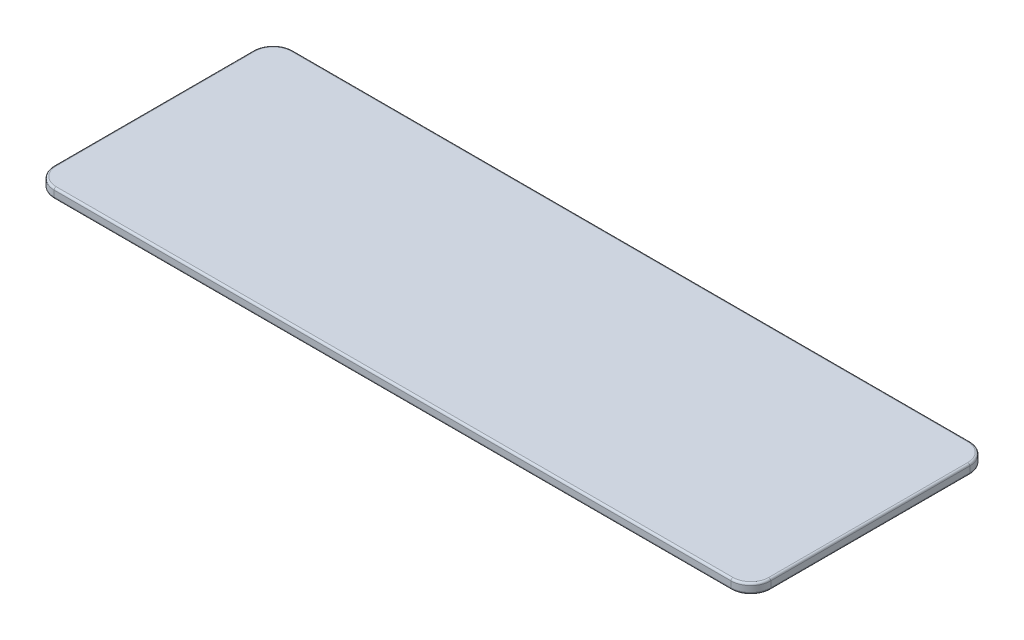
ISO-10303-21;
HEADER;
FILE_DESCRIPTION(('STEP AP214'),'2;1');
FILE_NAME('part.step','',(''),(''),'','','');
FILE_SCHEMA(('AUTOMOTIVE_DESIGN { 1 0 10303 214 1 1 1 1 }'));
ENDSEC;
DATA;
#1=APPLICATION_CONTEXT('core data for automotive mechanical design processes');
#2=APPLICATION_PROTOCOL_DEFINITION('international standard','automotive_design',2000,#1);
#3=PRODUCT_CONTEXT('',#1,'mechanical');
#4=PRODUCT('Part','Part','',(#3));
#5=PRODUCT_RELATED_PRODUCT_CATEGORY('part','',(#4));
#6=PRODUCT_DEFINITION_FORMATION('','',#4);
#7=PRODUCT_DEFINITION_CONTEXT('part definition',#1,'design');
#8=PRODUCT_DEFINITION('design','',#6,#7);
#9=PRODUCT_DEFINITION_SHAPE('','',#8);
#10=(LENGTH_UNIT() NAMED_UNIT(*) SI_UNIT(.MILLI.,.METRE.));
#11=(NAMED_UNIT(*) PLANE_ANGLE_UNIT() SI_UNIT($,.RADIAN.));
#12=(NAMED_UNIT(*) SI_UNIT($,.STERADIAN.) SOLID_ANGLE_UNIT());
#13=UNCERTAINTY_MEASURE_WITH_UNIT(LENGTH_MEASURE(1.E-05),#10,'distance_accuracy_value','');
#14=(GEOMETRIC_REPRESENTATION_CONTEXT(3) GLOBAL_UNCERTAINTY_ASSIGNED_CONTEXT((#13)) GLOBAL_UNIT_ASSIGNED_CONTEXT((#10,
#11,#12)) REPRESENTATION_CONTEXT('',''));
#15=CARTESIAN_POINT('',(0.,0.,0.));
#16=DIRECTION('',(0.,0.,1.));
#17=DIRECTION('',(1.,0.,0.));
#18=AXIS2_PLACEMENT_3D('',#15,#16,#17);
#19=CARTESIAN_POINT('',(-228.6,6.35,-76.2));
#20=DIRECTION('',(1.,0.,0.));
#21=DIRECTION('',(0.,0.,-1.));
#22=AXIS2_PLACEMENT_3D('',#19,#20,#21);
#23=PLANE('',#22);
#24=DIRECTION('',(0.,-1.,0.));
#25=VECTOR('',#24,1.);
#26=CARTESIAN_POINT('',(-228.6,6.35,63.5));
#27=LINE('',#26,#25);
#28=CARTESIAN_POINT('',(-228.6,1.27,63.5));
#29=VERTEX_POINT('',#28);
#30=CARTESIAN_POINT('',(-228.6,5.08,63.5));
#31=VERTEX_POINT('',#30);
#32=EDGE_CURVE('E277',#29,#31,#27,.F.);
#33=ORIENTED_EDGE('',*,*,#32,.T.);
#34=DIRECTION('',(0.,0.,1.));
#35=VECTOR('',#34,1.);
#36=CARTESIAN_POINT('',(-228.6,5.08,-63.5));
#37=LINE('',#36,#35);
#38=CARTESIAN_POINT('',(-228.6,5.08,-63.5));
#39=VERTEX_POINT('',#38);
#40=EDGE_CURVE('E182',#31,#39,#37,.F.);
#41=ORIENTED_EDGE('',*,*,#40,.T.);
#42=DIRECTION('',(0.,-1.,0.));
#43=VECTOR('',#42,1.);
#44=CARTESIAN_POINT('',(-228.6,6.35,-63.5));
#45=LINE('',#44,#43);
#46=CARTESIAN_POINT('',(-228.6,1.27,-63.5));
#47=VERTEX_POINT('',#46);
#48=EDGE_CURVE('E166',#39,#47,#45,.T.);
#49=ORIENTED_EDGE('',*,*,#48,.T.);
#50=DIRECTION('',(0.,0.,1.));
#51=VECTOR('',#50,1.);
#52=CARTESIAN_POINT('',(-228.6,1.27,-76.2));
#53=LINE('',#52,#51);
#54=EDGE_CURVE('E180',#47,#29,#53,.T.);
#55=ORIENTED_EDGE('',*,*,#54,.T.);
#56=EDGE_LOOP('',(#33,#41,#49,#55));
#57=FACE_BOUND('',#56,.T.);
#58=ADVANCED_FACE('F33',(#57),#23,.F.);
#59=CARTESIAN_POINT('',(-228.6,6.35,76.2));
#60=DIRECTION('',(0.,0.,-1.));
#61=DIRECTION('',(-1.,0.,0.));
#62=AXIS2_PLACEMENT_3D('',#59,#60,#61);
#63=PLANE('',#62);
#64=DIRECTION('',(0.,-1.,0.));
#65=VECTOR('',#64,1.);
#66=CARTESIAN_POINT('',(215.9,6.35,76.2));
#67=LINE('',#66,#65);
#68=CARTESIAN_POINT('',(215.9,1.27,76.2));
#69=VERTEX_POINT('',#68);
#70=CARTESIAN_POINT('',(215.9,5.08,76.2));
#71=VERTEX_POINT('',#70);
#72=EDGE_CURVE('E282',#69,#71,#67,.F.);
#73=ORIENTED_EDGE('',*,*,#72,.T.);
#74=DIRECTION('',(1.,0.,0.));
#75=VECTOR('',#74,1.);
#76=CARTESIAN_POINT('',(-215.9,5.08,76.2));
#77=LINE('',#76,#75);
#78=CARTESIAN_POINT('',(-215.9,5.08,76.2));
#79=VERTEX_POINT('',#78);
#80=EDGE_CURVE('E207',#71,#79,#77,.F.);
#81=ORIENTED_EDGE('',*,*,#80,.T.);
#82=DIRECTION('',(0.,-1.,0.));
#83=VECTOR('',#82,1.);
#84=CARTESIAN_POINT('',(-215.9,6.35,76.2));
#85=LINE('',#84,#83);
#86=CARTESIAN_POINT('',(-215.9,1.27,76.2));
#87=VERTEX_POINT('',#86);
#88=EDGE_CURVE('E275',#79,#87,#85,.T.);
#89=ORIENTED_EDGE('',*,*,#88,.T.);
#90=DIRECTION('',(1.,0.,0.));
#91=VECTOR('',#90,1.);
#92=CARTESIAN_POINT('',(-228.6,1.27,76.2));
#93=LINE('',#92,#91);
#94=EDGE_CURVE('E205',#87,#69,#93,.T.);
#95=ORIENTED_EDGE('',*,*,#94,.T.);
#96=EDGE_LOOP('',(#73,#81,#89,#95));
#97=FACE_BOUND('',#96,.T.);
#98=ADVANCED_FACE('F280',(#97),#63,.F.);
#99=CARTESIAN_POINT('',(228.6,6.35,-76.2));
#100=DIRECTION('',(-1.,0.,0.));
#101=DIRECTION('',(0.,0.,1.));
#102=AXIS2_PLACEMENT_3D('',#99,#100,#101);
#103=PLANE('',#102);
#104=DIRECTION('',(0.,-1.,0.));
#105=VECTOR('',#104,1.);
#106=CARTESIAN_POINT('',(228.6,6.35,-63.5));
#107=LINE('',#106,#105);
#108=CARTESIAN_POINT('',(228.6,1.27,-63.5));
#109=VERTEX_POINT('',#108);
#110=CARTESIAN_POINT('',(228.6,5.08,-63.5));
#111=VERTEX_POINT('',#110);
#112=EDGE_CURVE('E238',#109,#111,#107,.F.);
#113=ORIENTED_EDGE('',*,*,#112,.T.);
#114=DIRECTION('',(0.,0.,-1.));
#115=VECTOR('',#114,1.);
#116=CARTESIAN_POINT('',(228.6,5.08,63.5));
#117=LINE('',#116,#115);
#118=CARTESIAN_POINT('',(228.6,5.08,63.5));
#119=VERTEX_POINT('',#118);
#120=EDGE_CURVE('E199',#111,#119,#117,.F.);
#121=ORIENTED_EDGE('',*,*,#120,.T.);
#122=DIRECTION('',(0.,-1.,0.));
#123=VECTOR('',#122,1.);
#124=CARTESIAN_POINT('',(228.6,6.35,63.5));
#125=LINE('',#124,#123);
#126=CARTESIAN_POINT('',(228.6,1.27,63.5));
#127=VERTEX_POINT('',#126);
#128=EDGE_CURVE('E283',#119,#127,#125,.T.);
#129=ORIENTED_EDGE('',*,*,#128,.T.);
#130=DIRECTION('',(0.,0.,-1.));
#131=VECTOR('',#130,1.);
#132=CARTESIAN_POINT('',(228.6,1.27,-76.2));
#133=LINE('',#132,#131);
#134=EDGE_CURVE('E197',#127,#109,#133,.T.);
#135=ORIENTED_EDGE('',*,*,#134,.T.);
#136=EDGE_LOOP('',(#113,#121,#129,#135));
#137=FACE_BOUND('',#136,.T.);
#138=ADVANCED_FACE('F345',(#137),#103,.F.);
#139=CARTESIAN_POINT('',(-228.6,6.35,-76.2));
#140=DIRECTION('',(0.,0.,1.));
#141=DIRECTION('',(1.,0.,0.));
#142=AXIS2_PLACEMENT_3D('',#139,#140,#141);
#143=PLANE('',#142);
#144=DIRECTION('',(0.,-1.,0.));
#145=VECTOR('',#144,1.);
#146=CARTESIAN_POINT('',(-215.9,6.35,-76.2));
#147=LINE('',#146,#145);
#148=CARTESIAN_POINT('',(-215.9,1.27,-76.2));
#149=VERTEX_POINT('',#148);
#150=CARTESIAN_POINT('',(-215.9,5.08,-76.2));
#151=VERTEX_POINT('',#150);
#152=EDGE_CURVE('E285',#149,#151,#147,.F.);
#153=ORIENTED_EDGE('',*,*,#152,.T.);
#154=DIRECTION('',(-1.,0.,0.));
#155=VECTOR('',#154,1.);
#156=CARTESIAN_POINT('',(215.9,5.08,-76.2));
#157=LINE('',#156,#155);
#158=CARTESIAN_POINT('',(215.9,5.08,-76.2));
#159=VERTEX_POINT('',#158);
#160=EDGE_CURVE('E190',#151,#159,#157,.F.);
#161=ORIENTED_EDGE('',*,*,#160,.T.);
#162=DIRECTION('',(0.,-1.,0.));
#163=VECTOR('',#162,1.);
#164=CARTESIAN_POINT('',(215.9,6.35,-76.2));
#165=LINE('',#164,#163);
#166=CARTESIAN_POINT('',(215.9,1.27,-76.2));
#167=VERTEX_POINT('',#166);
#168=EDGE_CURVE('E293',#159,#167,#165,.T.);
#169=ORIENTED_EDGE('',*,*,#168,.T.);
#170=DIRECTION('',(-1.,0.,0.));
#171=VECTOR('',#170,1.);
#172=CARTESIAN_POINT('',(-228.6,1.27,-76.2));
#173=LINE('',#172,#171);
#174=EDGE_CURVE('E188',#167,#149,#173,.T.);
#175=ORIENTED_EDGE('',*,*,#174,.T.);
#176=EDGE_LOOP('',(#153,#161,#169,#175));
#177=FACE_BOUND('',#176,.T.);
#178=ADVANCED_FACE('F361',(#177),#143,.F.);
#179=CARTESIAN_POINT('',(-228.6,6.35,76.2));
#180=DIRECTION('',(0.,1.,0.));
#181=DIRECTION('',(0.,0.,1.));
#182=AXIS2_PLACEMENT_3D('',#179,#180,#181);
#183=PLANE('',#182);
#184=DIRECTION('',(0.,0.,1.));
#185=VECTOR('',#184,1.);
#186=CARTESIAN_POINT('',(-227.33,6.35,63.4999999999999));
#187=LINE('',#186,#185);
#188=CARTESIAN_POINT('',(-227.33,6.35,-63.5));
#189=VERTEX_POINT('',#188);
#190=CARTESIAN_POINT('',(-227.33,6.35,63.5));
#191=VERTEX_POINT('',#190);
#192=EDGE_CURVE('E170',#189,#191,#187,.T.);
#193=ORIENTED_EDGE('',*,*,#192,.T.);
#194=CARTESIAN_POINT('',(-215.9,6.35,63.5));
#195=DIRECTION('',(0.,1.,0.));
#196=DIRECTION('',(0.,0.,1.));
#197=AXIS2_PLACEMENT_3D('',#194,#195,#196);
#198=CIRCLE('',#197,11.43);
#199=CARTESIAN_POINT('',(-215.9,6.35,74.93));
#200=VERTEX_POINT('',#199);
#201=EDGE_CURVE('E151',#191,#200,#198,.T.);
#202=ORIENTED_EDGE('',*,*,#201,.T.);
#203=DIRECTION('',(1.,0.,0.));
#204=VECTOR('',#203,1.);
#205=CARTESIAN_POINT('',(215.9,6.35,74.93));
#206=LINE('',#205,#204);
#207=CARTESIAN_POINT('',(215.9,6.35,74.93));
#208=VERTEX_POINT('',#207);
#209=EDGE_CURVE('E159',#200,#208,#206,.T.);
#210=ORIENTED_EDGE('',*,*,#209,.T.);
#211=CARTESIAN_POINT('',(215.9,6.35,63.5));
#212=DIRECTION('',(0.,1.,0.));
#213=DIRECTION('',(0.,0.,1.));
#214=AXIS2_PLACEMENT_3D('',#211,#212,#213);
#215=CIRCLE('',#214,11.43);
#216=CARTESIAN_POINT('',(227.33,6.35,63.5));
#217=VERTEX_POINT('',#216);
#218=EDGE_CURVE('E165',#208,#217,#215,.T.);
#219=ORIENTED_EDGE('',*,*,#218,.T.);
#220=DIRECTION('',(0.,0.,-1.));
#221=VECTOR('',#220,1.);
#222=CARTESIAN_POINT('',(227.33,6.35,-63.5));
#223=LINE('',#222,#221);
#224=CARTESIAN_POINT('',(227.33,6.35,-63.5));
#225=VERTEX_POINT('',#224);
#226=EDGE_CURVE('E300',#217,#225,#223,.T.);
#227=ORIENTED_EDGE('',*,*,#226,.T.);
#228=CARTESIAN_POINT('',(215.9,6.35,-63.5));
#229=DIRECTION('',(0.,1.,0.));
#230=DIRECTION('',(0.,0.,1.));
#231=AXIS2_PLACEMENT_3D('',#228,#229,#230);
#232=CIRCLE('',#231,11.43);
#233=CARTESIAN_POINT('',(215.9,6.35,-74.93));
#234=VERTEX_POINT('',#233);
#235=EDGE_CURVE('E302',#225,#234,#232,.T.);
#236=ORIENTED_EDGE('',*,*,#235,.T.);
#237=DIRECTION('',(-1.,0.,0.));
#238=VECTOR('',#237,1.);
#239=CARTESIAN_POINT('',(-215.9,6.35,-74.93));
#240=LINE('',#239,#238);
#241=CARTESIAN_POINT('',(-215.9,6.35,-74.93));
#242=VERTEX_POINT('',#241);
#243=EDGE_CURVE('E304',#234,#242,#240,.T.);
#244=ORIENTED_EDGE('',*,*,#243,.T.);
#245=CARTESIAN_POINT('',(-215.9,6.35,-63.5));
#246=DIRECTION('',(0.,1.,0.));
#247=DIRECTION('',(0.,0.,1.));
#248=AXIS2_PLACEMENT_3D('',#245,#246,#247);
#249=CIRCLE('',#248,11.43);
#250=EDGE_CURVE('E175',#242,#189,#249,.T.);
#251=ORIENTED_EDGE('',*,*,#250,.T.);
#252=EDGE_LOOP('',(#193,#202,#210,#219,#227,#236,#244,#251));
#253=FACE_BOUND('',#252,.T.);
#254=ADVANCED_FACE('F168',(#253),#183,.T.);
#255=CARTESIAN_POINT('',(-228.6,0.,76.2));
#256=DIRECTION('',(0.,1.,0.));
#257=DIRECTION('',(0.,0.,1.));
#258=AXIS2_PLACEMENT_3D('',#255,#256,#257);
#259=PLANE('',#258);
#260=DIRECTION('',(-1.,0.,0.));
#261=VECTOR('',#260,1.);
#262=CARTESIAN_POINT('',(-228.6,0.,-74.93));
#263=LINE('',#262,#261);
#264=CARTESIAN_POINT('',(-215.9,0.,-74.93));
#265=VERTEX_POINT('',#264);
#266=CARTESIAN_POINT('',(215.9,0.,-74.93));
#267=VERTEX_POINT('',#266);
#268=EDGE_CURVE('E42',#265,#267,#263,.F.);
#269=ORIENTED_EDGE('',*,*,#268,.T.);
#270=CARTESIAN_POINT('',(215.9,0.,-63.5));
#271=DIRECTION('',(0.,1.,0.));
#272=DIRECTION('',(0.,0.,1.));
#273=AXIS2_PLACEMENT_3D('',#270,#271,#272);
#274=CIRCLE('',#273,11.43);
#275=CARTESIAN_POINT('',(227.33,0.,-63.5));
#276=VERTEX_POINT('',#275);
#277=EDGE_CURVE('E11',#267,#276,#274,.F.);
#278=ORIENTED_EDGE('',*,*,#277,.T.);
#279=DIRECTION('',(0.,0.,-1.));
#280=VECTOR('',#279,1.);
#281=CARTESIAN_POINT('',(227.33,0.,76.2));
#282=LINE('',#281,#280);
#283=CARTESIAN_POINT('',(227.33,0.,63.5));
#284=VERTEX_POINT('',#283);
#285=EDGE_CURVE('E209',#276,#284,#282,.F.);
#286=ORIENTED_EDGE('',*,*,#285,.T.);
#287=CARTESIAN_POINT('',(215.9,0.,63.5));
#288=DIRECTION('',(0.,1.,0.));
#289=DIRECTION('',(0.,0.,1.));
#290=AXIS2_PLACEMENT_3D('',#287,#288,#289);
#291=CIRCLE('',#290,11.43);
#292=CARTESIAN_POINT('',(215.9,0.,74.93));
#293=VERTEX_POINT('',#292);
#294=EDGE_CURVE('E211',#284,#293,#291,.F.);
#295=ORIENTED_EDGE('',*,*,#294,.T.);
#296=DIRECTION('',(1.,0.,0.));
#297=VECTOR('',#296,1.);
#298=CARTESIAN_POINT('',(-228.6,0.,74.93));
#299=LINE('',#298,#297);
#300=CARTESIAN_POINT('',(-215.9,0.,74.93));
#301=VERTEX_POINT('',#300);
#302=EDGE_CURVE('E213',#293,#301,#299,.F.);
#303=ORIENTED_EDGE('',*,*,#302,.T.);
#304=CARTESIAN_POINT('',(-215.9,0.,63.5));
#305=DIRECTION('',(0.,1.,0.));
#306=DIRECTION('',(0.,0.,1.));
#307=AXIS2_PLACEMENT_3D('',#304,#305,#306);
#308=CIRCLE('',#307,11.43);
#309=CARTESIAN_POINT('',(-227.33,0.,63.5));
#310=VERTEX_POINT('',#309);
#311=EDGE_CURVE('E215',#301,#310,#308,.F.);
#312=ORIENTED_EDGE('',*,*,#311,.T.);
#313=DIRECTION('',(0.,0.,1.));
#314=VECTOR('',#313,1.);
#315=CARTESIAN_POINT('',(-227.33,0.,76.2));
#316=LINE('',#315,#314);
#317=CARTESIAN_POINT('',(-227.33,0.,-63.5));
#318=VERTEX_POINT('',#317);
#319=EDGE_CURVE('E217',#310,#318,#316,.F.);
#320=ORIENTED_EDGE('',*,*,#319,.T.);
#321=CARTESIAN_POINT('',(-215.9,0.,-63.5));
#322=DIRECTION('',(0.,1.,0.));
#323=DIRECTION('',(0.,0.,1.));
#324=AXIS2_PLACEMENT_3D('',#321,#322,#323);
#325=CIRCLE('',#324,11.43);
#326=EDGE_CURVE('E53',#318,#265,#325,.F.);
#327=ORIENTED_EDGE('',*,*,#326,.T.);
#328=EDGE_LOOP('',(#269,#278,#286,#295,#303,#312,#320,#327));
#329=FACE_BOUND('',#328,.T.);
#330=ADVANCED_FACE('F332',(#329),#259,.F.);
#331=CARTESIAN_POINT('',(215.9,6.35,63.5));
#332=DIRECTION('',(0.,-1.,0.));
#333=DIRECTION('',(0.,0.,-1.));
#334=AXIS2_PLACEMENT_3D('',#331,#332,#333);
#335=CYLINDRICAL_SURFACE('',#334,12.7);
#336=ORIENTED_EDGE('',*,*,#128,.F.);
#337=CARTESIAN_POINT('',(215.9,5.08,63.5));
#338=DIRECTION('',(0.,1.,0.));
#339=DIRECTION('',(0.,0.,1.));
#340=AXIS2_PLACEMENT_3D('',#337,#338,#339);
#341=CIRCLE('',#340,12.7);
#342=EDGE_CURVE('E203',#119,#71,#341,.F.);
#343=ORIENTED_EDGE('',*,*,#342,.T.);
#344=ORIENTED_EDGE('',*,*,#72,.F.);
#345=CARTESIAN_POINT('',(215.9,1.27,63.5));
#346=DIRECTION('',(0.,1.,0.));
#347=DIRECTION('',(0.,0.,1.));
#348=AXIS2_PLACEMENT_3D('',#345,#346,#347);
#349=CIRCLE('',#348,12.7);
#350=EDGE_CURVE('E201',#69,#127,#349,.T.);
#351=ORIENTED_EDGE('',*,*,#350,.T.);
#352=EDGE_LOOP('',(#336,#343,#344,#351));
#353=FACE_BOUND('',#352,.T.);
#354=ADVANCED_FACE('F378',(#353),#335,.T.);
#355=CARTESIAN_POINT('',(215.9,6.35,-63.5));
#356=DIRECTION('',(0.,-1.,0.));
#357=DIRECTION('',(0.,0.,-1.));
#358=AXIS2_PLACEMENT_3D('',#355,#356,#357);
#359=CYLINDRICAL_SURFACE('',#358,12.7);
#360=ORIENTED_EDGE('',*,*,#168,.F.);
#361=CARTESIAN_POINT('',(215.9,5.08,-63.5));
#362=DIRECTION('',(0.,1.,0.));
#363=DIRECTION('',(0.,0.,1.));
#364=AXIS2_PLACEMENT_3D('',#361,#362,#363);
#365=CIRCLE('',#364,12.7);
#366=EDGE_CURVE('E195',#159,#111,#365,.F.);
#367=ORIENTED_EDGE('',*,*,#366,.T.);
#368=ORIENTED_EDGE('',*,*,#112,.F.);
#369=CARTESIAN_POINT('',(215.9,1.27,-63.5));
#370=DIRECTION('',(0.,1.,0.));
#371=DIRECTION('',(0.,0.,1.));
#372=AXIS2_PLACEMENT_3D('',#369,#370,#371);
#373=CIRCLE('',#372,12.7);
#374=EDGE_CURVE('E192',#109,#167,#373,.T.);
#375=ORIENTED_EDGE('',*,*,#374,.T.);
#376=EDGE_LOOP('',(#360,#367,#368,#375));
#377=FACE_BOUND('',#376,.T.);
#378=ADVANCED_FACE('F350',(#377),#359,.T.);
#379=CARTESIAN_POINT('',(-215.9,6.35,-63.5));
#380=DIRECTION('',(0.,-1.,0.));
#381=DIRECTION('',(0.,0.,-1.));
#382=AXIS2_PLACEMENT_3D('',#379,#380,#381);
#383=CYLINDRICAL_SURFACE('',#382,12.7);
#384=ORIENTED_EDGE('',*,*,#48,.F.);
#385=CARTESIAN_POINT('',(-215.9,5.08,-63.5));
#386=DIRECTION('',(0.,1.,0.));
#387=DIRECTION('',(0.,0.,1.));
#388=AXIS2_PLACEMENT_3D('',#385,#386,#387);
#389=CIRCLE('',#388,12.7);
#390=EDGE_CURVE('E186',#39,#151,#389,.F.);
#391=ORIENTED_EDGE('',*,*,#390,.T.);
#392=ORIENTED_EDGE('',*,*,#152,.F.);
#393=CARTESIAN_POINT('',(-215.9,1.27,-63.5));
#394=DIRECTION('',(0.,1.,0.));
#395=DIRECTION('',(0.,0.,1.));
#396=AXIS2_PLACEMENT_3D('',#393,#394,#395);
#397=CIRCLE('',#396,12.7);
#398=EDGE_CURVE('E184',#149,#47,#397,.T.);
#399=ORIENTED_EDGE('',*,*,#398,.T.);
#400=EDGE_LOOP('',(#384,#391,#392,#399));
#401=FACE_BOUND('',#400,.T.);
#402=ADVANCED_FACE('F318',(#401),#383,.T.);
#403=CARTESIAN_POINT('',(-215.9,6.35,63.5));
#404=DIRECTION('',(0.,-1.,0.));
#405=DIRECTION('',(0.,0.,-1.));
#406=AXIS2_PLACEMENT_3D('',#403,#404,#405);
#407=CYLINDRICAL_SURFACE('',#406,12.7);
#408=ORIENTED_EDGE('',*,*,#88,.F.);
#409=CARTESIAN_POINT('',(-215.9,5.08,63.5));
#410=DIRECTION('',(0.,1.,0.));
#411=DIRECTION('',(0.,0.,1.));
#412=AXIS2_PLACEMENT_3D('',#409,#410,#411);
#413=CIRCLE('',#412,12.7);
#414=EDGE_CURVE('E153',#79,#31,#413,.F.);
#415=ORIENTED_EDGE('',*,*,#414,.T.);
#416=ORIENTED_EDGE('',*,*,#32,.F.);
#417=CARTESIAN_POINT('',(-215.9,1.27,63.5));
#418=DIRECTION('',(0.,1.,0.));
#419=DIRECTION('',(0.,0.,1.));
#420=AXIS2_PLACEMENT_3D('',#417,#418,#419);
#421=CIRCLE('',#420,12.7);
#422=EDGE_CURVE('E172',#29,#87,#421,.T.);
#423=ORIENTED_EDGE('',*,*,#422,.T.);
#424=EDGE_LOOP('',(#408,#415,#416,#423));
#425=FACE_BOUND('',#424,.T.);
#426=ADVANCED_FACE('F274',(#425),#407,.T.);
#427=CARTESIAN_POINT('',(215.9,5.08,-63.5));
#428=DIRECTION('',(0.,1.,0.));
#429=DIRECTION('',(0.,0.,1.));
#430=AXIS2_PLACEMENT_3D('',#427,#428,#429);
#431=TOROIDAL_SURFACE('',#430,11.43,1.27);
#432=CARTESIAN_POINT('',(227.33,5.08,-63.5));
#433=DIRECTION('',(0.,0.,1.));
#434=DIRECTION('',(1.,0.,0.));
#435=AXIS2_PLACEMENT_3D('',#432,#433,#434);
#436=CIRCLE('',#435,1.27);
#437=EDGE_CURVE('E232',#111,#225,#436,.T.);
#438=ORIENTED_EDGE('',*,*,#437,.F.);
#439=ORIENTED_EDGE('',*,*,#366,.F.);
#440=CARTESIAN_POINT('',(215.9,5.08,-74.93));
#441=DIRECTION('',(-1.,0.,0.));
#442=DIRECTION('',(0.,0.,1.));
#443=AXIS2_PLACEMENT_3D('',#440,#441,#442);
#444=CIRCLE('',#443,1.27);
#445=EDGE_CURVE('E235',#234,#159,#444,.T.);
#446=ORIENTED_EDGE('',*,*,#445,.F.);
#447=ORIENTED_EDGE('',*,*,#235,.F.);
#448=EDGE_LOOP('',(#438,#439,#446,#447));
#449=FACE_BOUND('',#448,.T.);
#450=ADVANCED_FACE('F354',(#449),#431,.T.);
#451=CARTESIAN_POINT('',(-228.6,5.08,-74.93));
#452=DIRECTION('',(1.,0.,0.));
#453=DIRECTION('',(0.,0.,-1.));
#454=AXIS2_PLACEMENT_3D('',#451,#452,#453);
#455=CYLINDRICAL_SURFACE('',#454,1.27);
#456=ORIENTED_EDGE('',*,*,#445,.T.);
#457=ORIENTED_EDGE('',*,*,#160,.F.);
#458=CARTESIAN_POINT('',(-215.9,5.08,-74.93));
#459=DIRECTION('',(-1.,0.,0.));
#460=DIRECTION('',(0.,0.,1.));
#461=AXIS2_PLACEMENT_3D('',#458,#459,#460);
#462=CIRCLE('',#461,1.27);
#463=EDGE_CURVE('E229',#242,#151,#462,.T.);
#464=ORIENTED_EDGE('',*,*,#463,.F.);
#465=ORIENTED_EDGE('',*,*,#243,.F.);
#466=EDGE_LOOP('',(#456,#457,#464,#465));
#467=FACE_BOUND('',#466,.T.);
#468=ADVANCED_FACE('F359',(#467),#455,.T.);
#469=CARTESIAN_POINT('',(227.33,5.08,76.2));
#470=DIRECTION('',(0.,0.,1.));
#471=DIRECTION('',(1.,0.,0.));
#472=AXIS2_PLACEMENT_3D('',#469,#470,#471);
#473=CYLINDRICAL_SURFACE('',#472,1.27);
#474=ORIENTED_EDGE('',*,*,#437,.T.);
#475=ORIENTED_EDGE('',*,*,#226,.F.);
#476=CARTESIAN_POINT('',(227.33,5.08,63.5));
#477=DIRECTION('',(0.,0.,1.));
#478=DIRECTION('',(1.,0.,0.));
#479=AXIS2_PLACEMENT_3D('',#476,#477,#478);
#480=CIRCLE('',#479,1.27);
#481=EDGE_CURVE('E226',#119,#217,#480,.T.);
#482=ORIENTED_EDGE('',*,*,#481,.F.);
#483=ORIENTED_EDGE('',*,*,#120,.F.);
#484=EDGE_LOOP('',(#474,#475,#482,#483));
#485=FACE_BOUND('',#484,.T.);
#486=ADVANCED_FACE('F400',(#485),#473,.T.);
#487=CARTESIAN_POINT('',(-215.9,5.08,-63.5));
#488=DIRECTION('',(0.,1.,0.));
#489=DIRECTION('',(0.,0.,1.));
#490=AXIS2_PLACEMENT_3D('',#487,#488,#489);
#491=TOROIDAL_SURFACE('',#490,11.43,1.27);
#492=ORIENTED_EDGE('',*,*,#463,.T.);
#493=ORIENTED_EDGE('',*,*,#390,.F.);
#494=CARTESIAN_POINT('',(-227.33,5.08,-63.5));
#495=DIRECTION('',(0.,0.,1.));
#496=DIRECTION('',(1.,0.,0.));
#497=AXIS2_PLACEMENT_3D('',#494,#495,#496);
#498=CIRCLE('',#497,1.27);
#499=EDGE_CURVE('E223',#189,#39,#498,.T.);
#500=ORIENTED_EDGE('',*,*,#499,.F.);
#501=ORIENTED_EDGE('',*,*,#250,.F.);
#502=EDGE_LOOP('',(#492,#493,#500,#501));
#503=FACE_BOUND('',#502,.T.);
#504=ADVANCED_FACE('F311',(#503),#491,.T.);
#505=CARTESIAN_POINT('',(215.9,5.08,63.5));
#506=DIRECTION('',(0.,1.,0.));
#507=DIRECTION('',(0.,0.,1.));
#508=AXIS2_PLACEMENT_3D('',#505,#506,#507);
#509=TOROIDAL_SURFACE('',#508,11.43,1.27);
#510=ORIENTED_EDGE('',*,*,#481,.T.);
#511=ORIENTED_EDGE('',*,*,#218,.F.);
#512=CARTESIAN_POINT('',(215.9,5.08,74.93));
#513=DIRECTION('',(-1.,0.,0.));
#514=DIRECTION('',(0.,0.,1.));
#515=AXIS2_PLACEMENT_3D('',#512,#513,#514);
#516=CIRCLE('',#515,1.27);
#517=EDGE_CURVE('E162',#71,#208,#516,.T.);
#518=ORIENTED_EDGE('',*,*,#517,.F.);
#519=ORIENTED_EDGE('',*,*,#342,.F.);
#520=EDGE_LOOP('',(#510,#511,#518,#519));
#521=FACE_BOUND('',#520,.T.);
#522=ADVANCED_FACE('F394',(#521),#509,.T.);
#523=CARTESIAN_POINT('',(-227.33,5.08,76.2));
#524=DIRECTION('',(0.,0.,-1.));
#525=DIRECTION('',(-1.,0.,0.));
#526=AXIS2_PLACEMENT_3D('',#523,#524,#525);
#527=CYLINDRICAL_SURFACE('',#526,1.27);
#528=ORIENTED_EDGE('',*,*,#499,.T.);
#529=ORIENTED_EDGE('',*,*,#40,.F.);
#530=CARTESIAN_POINT('',(-227.33,5.08,63.5));
#531=DIRECTION('',(0.,0.,1.));
#532=DIRECTION('',(1.,0.,0.));
#533=AXIS2_PLACEMENT_3D('',#530,#531,#532);
#534=CIRCLE('',#533,1.27);
#535=EDGE_CURVE('E156',#191,#31,#534,.T.);
#536=ORIENTED_EDGE('',*,*,#535,.F.);
#537=ORIENTED_EDGE('',*,*,#192,.F.);
#538=EDGE_LOOP('',(#528,#529,#536,#537));
#539=FACE_BOUND('',#538,.T.);
#540=ADVANCED_FACE('F314',(#539),#527,.T.);
#541=CARTESIAN_POINT('',(-228.6,5.08,74.93));
#542=DIRECTION('',(-1.,0.,0.));
#543=DIRECTION('',(0.,0.,1.));
#544=AXIS2_PLACEMENT_3D('',#541,#542,#543);
#545=CYLINDRICAL_SURFACE('',#544,1.27);
#546=ORIENTED_EDGE('',*,*,#517,.T.);
#547=ORIENTED_EDGE('',*,*,#209,.F.);
#548=CARTESIAN_POINT('',(-215.9,5.08,74.93));
#549=DIRECTION('',(-1.,0.,0.));
#550=DIRECTION('',(0.,0.,1.));
#551=AXIS2_PLACEMENT_3D('',#548,#549,#550);
#552=CIRCLE('',#551,1.27);
#553=EDGE_CURVE('E147',#79,#200,#552,.T.);
#554=ORIENTED_EDGE('',*,*,#553,.F.);
#555=ORIENTED_EDGE('',*,*,#80,.F.);
#556=EDGE_LOOP('',(#546,#547,#554,#555));
#557=FACE_BOUND('',#556,.T.);
#558=ADVANCED_FACE('F160',(#557),#545,.T.);
#559=CARTESIAN_POINT('',(-215.9,5.08,63.5));
#560=DIRECTION('',(0.,1.,0.));
#561=DIRECTION('',(0.,0.,1.));
#562=AXIS2_PLACEMENT_3D('',#559,#560,#561);
#563=TOROIDAL_SURFACE('',#562,11.43,1.27);
#564=ORIENTED_EDGE('',*,*,#535,.T.);
#565=ORIENTED_EDGE('',*,*,#414,.F.);
#566=ORIENTED_EDGE('',*,*,#553,.T.);
#567=ORIENTED_EDGE('',*,*,#201,.F.);
#568=EDGE_LOOP('',(#564,#565,#566,#567));
#569=FACE_BOUND('',#568,.T.);
#570=ADVANCED_FACE('F149',(#569),#563,.T.);
#571=CARTESIAN_POINT('',(-215.9,1.27,63.5));
#572=DIRECTION('',(0.,1.,0.));
#573=DIRECTION('',(0.,0.,1.));
#574=AXIS2_PLACEMENT_3D('',#571,#572,#573);
#575=TOROIDAL_SURFACE('',#574,11.43,1.27);
#576=CARTESIAN_POINT('',(-215.9,1.27,74.93));
#577=DIRECTION('',(1.,0.,0.));
#578=DIRECTION('',(0.,0.,-1.));
#579=AXIS2_PLACEMENT_3D('',#576,#577,#578);
#580=CIRCLE('',#579,1.27);
#581=EDGE_CURVE('E254',#87,#301,#580,.T.);
#582=ORIENTED_EDGE('',*,*,#581,.F.);
#583=ORIENTED_EDGE('',*,*,#422,.F.);
#584=CARTESIAN_POINT('',(-227.33,1.27,63.5));
#585=DIRECTION('',(0.,0.,-1.));
#586=DIRECTION('',(-1.,0.,0.));
#587=AXIS2_PLACEMENT_3D('',#584,#585,#586);
#588=CIRCLE('',#587,1.27);
#589=EDGE_CURVE('E37',#310,#29,#588,.T.);
#590=ORIENTED_EDGE('',*,*,#589,.F.);
#591=ORIENTED_EDGE('',*,*,#311,.F.);
#592=EDGE_LOOP('',(#582,#583,#590,#591));
#593=FACE_BOUND('',#592,.T.);
#594=ADVANCED_FACE('F35',(#593),#575,.T.);
#595=CARTESIAN_POINT('',(-227.33,1.27,-76.2));
#596=DIRECTION('',(0.,0.,1.));
#597=DIRECTION('',(1.,0.,0.));
#598=AXIS2_PLACEMENT_3D('',#595,#596,#597);
#599=CYLINDRICAL_SURFACE('',#598,1.27);
#600=ORIENTED_EDGE('',*,*,#589,.T.);
#601=ORIENTED_EDGE('',*,*,#54,.F.);
#602=CARTESIAN_POINT('',(-227.33,1.27,-63.5));
#603=DIRECTION('',(0.,0.,-1.));
#604=DIRECTION('',(-1.,0.,0.));
#605=AXIS2_PLACEMENT_3D('',#602,#603,#604);
#606=CIRCLE('',#605,1.27);
#607=EDGE_CURVE('E252',#318,#47,#606,.T.);
#608=ORIENTED_EDGE('',*,*,#607,.F.);
#609=ORIENTED_EDGE('',*,*,#319,.F.);
#610=EDGE_LOOP('',(#600,#601,#608,#609));
#611=FACE_BOUND('',#610,.T.);
#612=ADVANCED_FACE('F265',(#611),#599,.T.);
#613=CARTESIAN_POINT('',(-228.6,1.27,74.93));
#614=DIRECTION('',(1.,0.,0.));
#615=DIRECTION('',(0.,0.,-1.));
#616=AXIS2_PLACEMENT_3D('',#613,#614,#615);
#617=CYLINDRICAL_SURFACE('',#616,1.27);
#618=ORIENTED_EDGE('',*,*,#581,.T.);
#619=ORIENTED_EDGE('',*,*,#302,.F.);
#620=CARTESIAN_POINT('',(215.9,1.27,74.93));
#621=DIRECTION('',(1.,0.,0.));
#622=DIRECTION('',(0.,0.,-1.));
#623=AXIS2_PLACEMENT_3D('',#620,#621,#622);
#624=CIRCLE('',#623,1.27);
#625=EDGE_CURVE('E249',#69,#293,#624,.T.);
#626=ORIENTED_EDGE('',*,*,#625,.F.);
#627=ORIENTED_EDGE('',*,*,#94,.F.);
#628=EDGE_LOOP('',(#618,#619,#626,#627));
#629=FACE_BOUND('',#628,.T.);
#630=ADVANCED_FACE('F418',(#629),#617,.T.);
#631=CARTESIAN_POINT('',(-215.9,1.27,-63.5));
#632=DIRECTION('',(0.,1.,0.));
#633=DIRECTION('',(0.,0.,1.));
#634=AXIS2_PLACEMENT_3D('',#631,#632,#633);
#635=TOROIDAL_SURFACE('',#634,11.43,1.27);
#636=ORIENTED_EDGE('',*,*,#607,.T.);
#637=ORIENTED_EDGE('',*,*,#398,.F.);
#638=CARTESIAN_POINT('',(-215.9,1.27,-74.93));
#639=DIRECTION('',(1.,0.,0.));
#640=DIRECTION('',(0.,0.,-1.));
#641=AXIS2_PLACEMENT_3D('',#638,#639,#640);
#642=CIRCLE('',#641,1.27);
#643=EDGE_CURVE('E246',#265,#149,#642,.T.);
#644=ORIENTED_EDGE('',*,*,#643,.F.);
#645=ORIENTED_EDGE('',*,*,#326,.F.);
#646=EDGE_LOOP('',(#636,#637,#644,#645));
#647=FACE_BOUND('',#646,.T.);
#648=ADVANCED_FACE('F322',(#647),#635,.T.);
#649=CARTESIAN_POINT('',(215.9,1.27,63.5));
#650=DIRECTION('',(0.,1.,0.));
#651=DIRECTION('',(0.,0.,1.));
#652=AXIS2_PLACEMENT_3D('',#649,#650,#651);
#653=TOROIDAL_SURFACE('',#652,11.43,1.27);
#654=ORIENTED_EDGE('',*,*,#625,.T.);
#655=ORIENTED_EDGE('',*,*,#294,.F.);
#656=CARTESIAN_POINT('',(227.33,1.27,63.5));
#657=DIRECTION('',(0.,0.,-1.));
#658=DIRECTION('',(-1.,0.,0.));
#659=AXIS2_PLACEMENT_3D('',#656,#657,#658);
#660=CIRCLE('',#659,1.27);
#661=EDGE_CURVE('E243',#127,#284,#660,.T.);
#662=ORIENTED_EDGE('',*,*,#661,.F.);
#663=ORIENTED_EDGE('',*,*,#350,.F.);
#664=EDGE_LOOP('',(#654,#655,#662,#663));
#665=FACE_BOUND('',#664,.T.);
#666=ADVANCED_FACE('F337',(#665),#653,.T.);
#667=CARTESIAN_POINT('',(-228.6,1.27,-74.93));
#668=DIRECTION('',(-1.,0.,0.));
#669=DIRECTION('',(0.,0.,1.));
#670=AXIS2_PLACEMENT_3D('',#667,#668,#669);
#671=CYLINDRICAL_SURFACE('',#670,1.27);
#672=ORIENTED_EDGE('',*,*,#643,.T.);
#673=ORIENTED_EDGE('',*,*,#174,.F.);
#674=CARTESIAN_POINT('',(215.9,1.27,-74.93));
#675=DIRECTION('',(1.,0.,0.));
#676=DIRECTION('',(0.,0.,-1.));
#677=AXIS2_PLACEMENT_3D('',#674,#675,#676);
#678=CIRCLE('',#677,1.27);
#679=EDGE_CURVE('E241',#267,#167,#678,.T.);
#680=ORIENTED_EDGE('',*,*,#679,.F.);
#681=ORIENTED_EDGE('',*,*,#268,.F.);
#682=EDGE_LOOP('',(#672,#673,#680,#681));
#683=FACE_BOUND('',#682,.T.);
#684=ADVANCED_FACE('F325',(#683),#671,.T.);
#685=CARTESIAN_POINT('',(227.33,1.27,-76.2));
#686=DIRECTION('',(0.,0.,-1.));
#687=DIRECTION('',(-1.,0.,0.));
#688=AXIS2_PLACEMENT_3D('',#685,#686,#687);
#689=CYLINDRICAL_SURFACE('',#688,1.27);
#690=ORIENTED_EDGE('',*,*,#661,.T.);
#691=ORIENTED_EDGE('',*,*,#285,.F.);
#692=CARTESIAN_POINT('',(227.33,1.27,-63.5));
#693=DIRECTION('',(0.,0.,-1.));
#694=DIRECTION('',(-1.,0.,0.));
#695=AXIS2_PLACEMENT_3D('',#692,#693,#694);
#696=CIRCLE('',#695,1.27);
#697=EDGE_CURVE('E239',#109,#276,#696,.T.);
#698=ORIENTED_EDGE('',*,*,#697,.F.);
#699=ORIENTED_EDGE('',*,*,#134,.F.);
#700=EDGE_LOOP('',(#690,#691,#698,#699));
#701=FACE_BOUND('',#700,.T.);
#702=ADVANCED_FACE('F341',(#701),#689,.T.);
#703=CARTESIAN_POINT('',(215.9,1.27,-63.5));
#704=DIRECTION('',(0.,1.,0.));
#705=DIRECTION('',(0.,0.,1.));
#706=AXIS2_PLACEMENT_3D('',#703,#704,#705);
#707=TOROIDAL_SURFACE('',#706,11.43,1.27);
#708=ORIENTED_EDGE('',*,*,#679,.T.);
#709=ORIENTED_EDGE('',*,*,#374,.F.);
#710=ORIENTED_EDGE('',*,*,#697,.T.);
#711=ORIENTED_EDGE('',*,*,#277,.F.);
#712=EDGE_LOOP('',(#708,#709,#710,#711));
#713=FACE_BOUND('',#712,.T.);
#714=ADVANCED_FACE('F329',(#713),#707,.T.);
#715=CLOSED_SHELL('',(#58,#98,#138,#178,#254,#330,#354,#378,#402,#426,#450,#468,#486,#504,#522,
#540,#558,#570,#594,#612,#630,#648,#666,#684,#702,#714));
#716=MANIFOLD_SOLID_BREP('B2',#715);
#717=ADVANCED_BREP_SHAPE_REPRESENTATION('',(#18,#716),#14);
#718=SHAPE_DEFINITION_REPRESENTATION(#9,#717);
ENDSEC;
END-ISO-10303-21;
